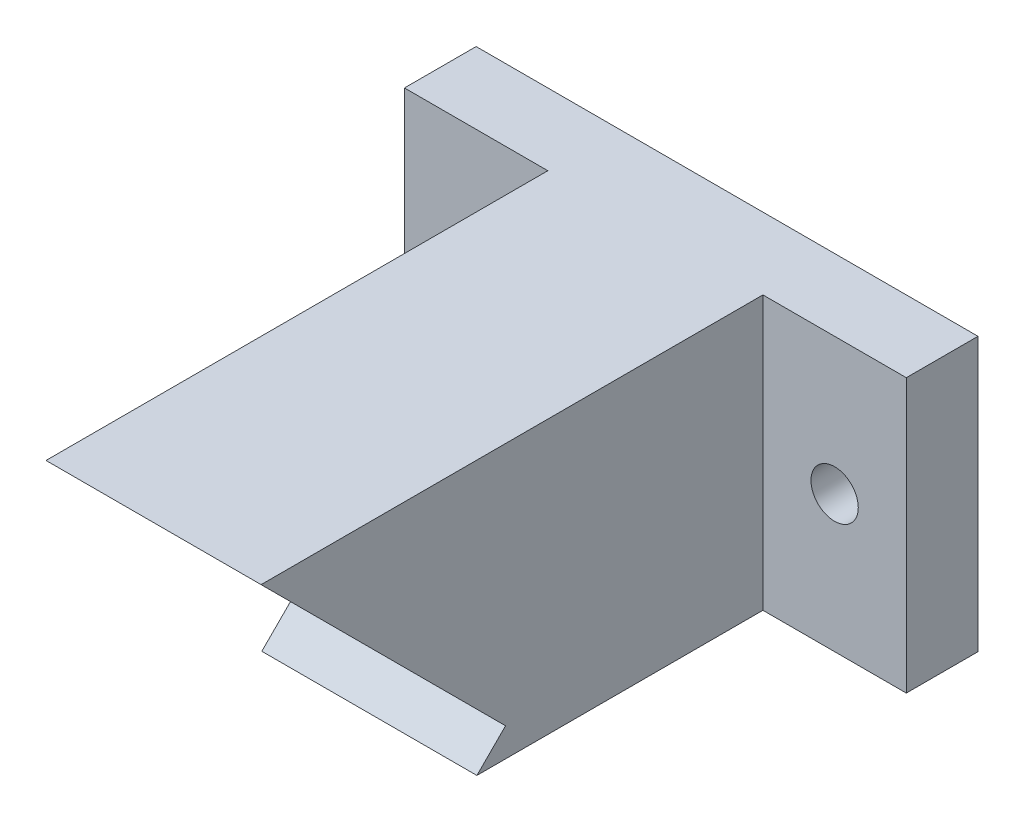
ISO-10303-21;
HEADER;
FILE_DESCRIPTION(('STEP AP214'),'2;1');
FILE_NAME('part.step','',(''),(''),'','','');
FILE_SCHEMA(('AUTOMOTIVE_DESIGN { 1 0 10303 214 1 1 1 1 }'));
ENDSEC;
DATA;
#1=APPLICATION_CONTEXT('core data for automotive mechanical design processes');
#2=APPLICATION_PROTOCOL_DEFINITION('international standard','automotive_design',2000,#1);
#3=PRODUCT_CONTEXT('',#1,'mechanical');
#4=PRODUCT('Part','Part','',(#3));
#5=PRODUCT_RELATED_PRODUCT_CATEGORY('part','',(#4));
#6=PRODUCT_DEFINITION_FORMATION('','',#4);
#7=PRODUCT_DEFINITION_CONTEXT('part definition',#1,'design');
#8=PRODUCT_DEFINITION('design','',#6,#7);
#9=PRODUCT_DEFINITION_SHAPE('','',#8);
#10=(LENGTH_UNIT() NAMED_UNIT(*) SI_UNIT(.MILLI.,.METRE.));
#11=(NAMED_UNIT(*) PLANE_ANGLE_UNIT() SI_UNIT($,.RADIAN.));
#12=(NAMED_UNIT(*) SI_UNIT($,.STERADIAN.) SOLID_ANGLE_UNIT());
#13=UNCERTAINTY_MEASURE_WITH_UNIT(LENGTH_MEASURE(1.E-05),#10,'distance_accuracy_value','');
#14=(GEOMETRIC_REPRESENTATION_CONTEXT(3) GLOBAL_UNCERTAINTY_ASSIGNED_CONTEXT((#13)) GLOBAL_UNIT_ASSIGNED_CONTEXT((#10,
#11,#12)) REPRESENTATION_CONTEXT('',''));
#15=CARTESIAN_POINT('',(0.,0.,0.));
#16=DIRECTION('',(0.,0.,1.));
#17=DIRECTION('',(1.,0.,0.));
#18=AXIS2_PLACEMENT_3D('',#15,#16,#17);
#19=CARTESIAN_POINT('',(7.5,-5.,40.));
#20=DIRECTION('',(-1.,0.,0.));
#21=DIRECTION('',(0.,0.,1.));
#22=AXIS2_PLACEMENT_3D('',#19,#20,#21);
#23=PLANE('',#22);
#24=DIRECTION('',(0.,0.707106781186547,0.707106781186548));
#25=VECTOR('',#24,1.);
#26=CARTESIAN_POINT('',(7.5,-5.,30.));
#27=LINE('',#26,#25);
#28=CARTESIAN_POINT('',(7.5,-12.0507433742728,22.9492566257272));
#29=VERTEX_POINT('',#28);
#30=CARTESIAN_POINT('',(7.5,5.,40.));
#31=VERTEX_POINT('',#30);
#32=EDGE_CURVE('E155',#29,#31,#27,.T.);
#33=ORIENTED_EDGE('',*,*,#32,.F.);
#34=DIRECTION('',(0.,0.707106781186559,-0.707106781186536));
#35=VECTOR('',#34,1.);
#36=CARTESIAN_POINT('',(7.5,-12.0507433742728,22.9492566257272));
#37=LINE('',#36,#35);
#38=CARTESIAN_POINT('',(7.5,-14.0507433742728,24.9492566257272));
#39=VERTEX_POINT('',#38);
#40=EDGE_CURVE('E149',#39,#29,#37,.T.);
#41=ORIENTED_EDGE('',*,*,#40,.F.);
#42=DIRECTION('',(0.,0.,1.));
#43=VECTOR('',#42,1.);
#44=CARTESIAN_POINT('',(7.5,-14.0507433742728,24.5));
#45=LINE('',#44,#43);
#46=CARTESIAN_POINT('',(7.5,-14.0507433742728,5.));
#47=VERTEX_POINT('',#46);
#48=EDGE_CURVE('E134',#47,#39,#45,.T.);
#49=ORIENTED_EDGE('',*,*,#48,.F.);
#50=DIRECTION('',(0.,-1.,0.));
#51=VECTOR('',#50,1.);
#52=CARTESIAN_POINT('',(7.5,-5.,5.));
#53=LINE('',#52,#51);
#54=CARTESIAN_POINT('',(7.5,5.,5.));
#55=VERTEX_POINT('',#54);
#56=EDGE_CURVE('E51',#55,#47,#53,.T.);
#57=ORIENTED_EDGE('',*,*,#56,.F.);
#58=DIRECTION('',(0.,0.,-1.));
#59=VECTOR('',#58,1.);
#60=CARTESIAN_POINT('',(7.5,5.,40.));
#61=LINE('',#60,#59);
#62=EDGE_CURVE('E244',#31,#55,#61,.T.);
#63=ORIENTED_EDGE('',*,*,#62,.F.);
#64=EDGE_LOOP('',(#33,#41,#49,#57,#63));
#65=FACE_BOUND('',#64,.T.);
#66=ADVANCED_FACE('F37',(#65),#23,.F.);
#67=CARTESIAN_POINT('',(-7.5,-5.,40.));
#68=DIRECTION('',(1.,0.,0.));
#69=DIRECTION('',(0.,0.,-1.));
#70=AXIS2_PLACEMENT_3D('',#67,#68,#69);
#71=PLANE('',#70);
#72=DIRECTION('',(0.,1.,0.));
#73=VECTOR('',#72,1.);
#74=CARTESIAN_POINT('',(-7.5,-5.,5.));
#75=LINE('',#74,#73);
#76=CARTESIAN_POINT('',(-7.5,-14.0507433742728,5.));
#77=VERTEX_POINT('',#76);
#78=CARTESIAN_POINT('',(-7.5,5.,5.));
#79=VERTEX_POINT('',#78);
#80=EDGE_CURVE('E211',#77,#79,#75,.T.);
#81=ORIENTED_EDGE('',*,*,#80,.F.);
#82=DIRECTION('',(0.,0.,-1.));
#83=VECTOR('',#82,1.);
#84=CARTESIAN_POINT('',(-7.5,-14.0507433742728,0.));
#85=LINE('',#84,#83);
#86=CARTESIAN_POINT('',(-7.5,-14.0507433742728,24.9492566257272));
#87=VERTEX_POINT('',#86);
#88=EDGE_CURVE('E231',#87,#77,#85,.T.);
#89=ORIENTED_EDGE('',*,*,#88,.F.);
#90=DIRECTION('',(0.,0.707106781186559,-0.707106781186536));
#91=VECTOR('',#90,1.);
#92=CARTESIAN_POINT('',(-7.5,-12.0507433742728,22.9492566257272));
#93=LINE('',#92,#91);
#94=CARTESIAN_POINT('',(-7.5,-12.0507433742728,22.9492566257272));
#95=VERTEX_POINT('',#94);
#96=EDGE_CURVE('E152',#87,#95,#93,.T.);
#97=ORIENTED_EDGE('',*,*,#96,.T.);
#98=DIRECTION('',(0.,0.707106781186547,0.707106781186548));
#99=VECTOR('',#98,1.);
#100=CARTESIAN_POINT('',(-7.5,0.,35.));
#101=LINE('',#100,#99);
#102=CARTESIAN_POINT('',(-7.5,5.,40.));
#103=VERTEX_POINT('',#102);
#104=EDGE_CURVE('E237',#95,#103,#101,.T.);
#105=ORIENTED_EDGE('',*,*,#104,.T.);
#106=DIRECTION('',(0.,0.,-1.));
#107=VECTOR('',#106,1.);
#108=CARTESIAN_POINT('',(-7.5,5.,40.));
#109=LINE('',#108,#107);
#110=EDGE_CURVE('E59',#103,#79,#109,.T.);
#111=ORIENTED_EDGE('',*,*,#110,.T.);
#112=EDGE_LOOP('',(#81,#89,#97,#105,#111));
#113=FACE_BOUND('',#112,.T.);
#114=ADVANCED_FACE('F279',(#113),#71,.F.);
#115=CARTESIAN_POINT('',(0.,-12.0507433742728,0.));
#116=DIRECTION('',(0.,1.,0.));
#117=DIRECTION('',(0.,0.,1.));
#118=AXIS2_PLACEMENT_3D('',#115,#116,#117);
#119=PLANE('',#118);
#120=DIRECTION('',(-1.,0.,0.));
#121=VECTOR('',#120,1.);
#122=CARTESIAN_POINT('',(17.5,-12.0507433742728,22.9492566257272));
#123=LINE('',#122,#121);
#124=CARTESIAN_POINT('',(5.5,-12.0507433742728,22.9492566257272));
#125=VERTEX_POINT('',#124);
#126=CARTESIAN_POINT('',(-5.5,-12.0507433742728,22.9492566257272));
#127=VERTEX_POINT('',#126);
#128=EDGE_CURVE('E153',#125,#127,#123,.T.);
#129=ORIENTED_EDGE('',*,*,#128,.F.);
#130=DIRECTION('',(0.,0.,-1.));
#131=VECTOR('',#130,1.);
#132=CARTESIAN_POINT('',(5.5,-12.0507433742728,40.));
#133=LINE('',#132,#131);
#134=CARTESIAN_POINT('',(5.5,-12.0507433742728,5.));
#135=VERTEX_POINT('',#134);
#136=EDGE_CURVE('E222',#125,#135,#133,.T.);
#137=ORIENTED_EDGE('',*,*,#136,.T.);
#138=DIRECTION('',(-1.,0.,0.));
#139=VECTOR('',#138,1.);
#140=CARTESIAN_POINT('',(0.,-12.0507433742728,5.));
#141=LINE('',#140,#139);
#142=CARTESIAN_POINT('',(-5.5,-12.0507433742728,5.));
#143=VERTEX_POINT('',#142);
#144=EDGE_CURVE('E206',#135,#143,#141,.T.);
#145=ORIENTED_EDGE('',*,*,#144,.T.);
#146=DIRECTION('',(0.,0.,-1.));
#147=VECTOR('',#146,1.);
#148=CARTESIAN_POINT('',(-5.5,-12.0507433742728,40.));
#149=LINE('',#148,#147);
#150=EDGE_CURVE('E219',#127,#143,#149,.T.);
#151=ORIENTED_EDGE('',*,*,#150,.F.);
#152=EDGE_LOOP('',(#129,#137,#145,#151));
#153=FACE_BOUND('',#152,.T.);
#154=ADVANCED_FACE('F264',(#153),#119,.T.);
#155=CARTESIAN_POINT('',(0.,3.,40.));
#156=DIRECTION('',(0.,1.,0.));
#157=DIRECTION('',(-1.,0.,0.));
#158=AXIS2_PLACEMENT_3D('',#155,#156,#157);
#159=PLANE('',#158);
#160=DIRECTION('',(-1.,0.,0.));
#161=VECTOR('',#160,1.);
#162=CARTESIAN_POINT('',(0.,3.,5.));
#163=LINE('',#162,#161);
#164=CARTESIAN_POINT('',(5.5,3.,5.));
#165=VERTEX_POINT('',#164);
#166=CARTESIAN_POINT('',(-5.5,3.,5.));
#167=VERTEX_POINT('',#166);
#168=EDGE_CURVE('E195',#165,#167,#163,.T.);
#169=ORIENTED_EDGE('',*,*,#168,.F.);
#170=DIRECTION('',(0.,0.,-1.));
#171=VECTOR('',#170,1.);
#172=CARTESIAN_POINT('',(5.5,3.,40.));
#173=LINE('',#172,#171);
#174=CARTESIAN_POINT('',(5.5,3.,38.));
#175=VERTEX_POINT('',#174);
#176=EDGE_CURVE('E214',#175,#165,#173,.T.);
#177=ORIENTED_EDGE('',*,*,#176,.F.);
#178=DIRECTION('',(1.,0.,0.));
#179=VECTOR('',#178,1.);
#180=CARTESIAN_POINT('',(-32.5,3.,38.));
#181=LINE('',#180,#179);
#182=CARTESIAN_POINT('',(-5.5,3.,38.));
#183=VERTEX_POINT('',#182);
#184=EDGE_CURVE('E44',#183,#175,#181,.T.);
#185=ORIENTED_EDGE('',*,*,#184,.F.);
#186=DIRECTION('',(0.,0.,-1.));
#187=VECTOR('',#186,1.);
#188=CARTESIAN_POINT('',(-5.5,3.,40.));
#189=LINE('',#188,#187);
#190=EDGE_CURVE('E215',#183,#167,#189,.T.);
#191=ORIENTED_EDGE('',*,*,#190,.T.);
#192=EDGE_LOOP('',(#169,#177,#185,#191));
#193=FACE_BOUND('',#192,.T.);
#194=ADVANCED_FACE('F253',(#193),#159,.F.);
#195=CARTESIAN_POINT('',(-5.5,0.,40.));
#196=DIRECTION('',(-1.,0.,0.));
#197=DIRECTION('',(0.,-1.,0.));
#198=AXIS2_PLACEMENT_3D('',#195,#196,#197);
#199=PLANE('',#198);
#200=DIRECTION('',(0.,-1.,0.));
#201=VECTOR('',#200,1.);
#202=CARTESIAN_POINT('',(-5.5,0.,5.));
#203=LINE('',#202,#201);
#204=EDGE_CURVE('E208',#167,#143,#203,.T.);
#205=ORIENTED_EDGE('',*,*,#204,.F.);
#206=ORIENTED_EDGE('',*,*,#190,.F.);
#207=DIRECTION('',(0.,0.707106781186547,0.707106781186548));
#208=VECTOR('',#207,1.);
#209=CARTESIAN_POINT('',(-5.5,-5.,30.));
#210=LINE('',#209,#208);
#211=EDGE_CURVE('E228',#127,#183,#210,.T.);
#212=ORIENTED_EDGE('',*,*,#211,.F.);
#213=ORIENTED_EDGE('',*,*,#150,.T.);
#214=EDGE_LOOP('',(#205,#206,#212,#213));
#215=FACE_BOUND('',#214,.T.);
#216=ADVANCED_FACE('F255',(#215),#199,.F.);
#217=CARTESIAN_POINT('',(5.5,0.,40.));
#218=DIRECTION('',(1.,0.,0.));
#219=DIRECTION('',(0.,0.,-1.));
#220=AXIS2_PLACEMENT_3D('',#217,#218,#219);
#221=PLANE('',#220);
#222=DIRECTION('',(0.,1.,0.));
#223=VECTOR('',#222,1.);
#224=CARTESIAN_POINT('',(5.5,0.,5.));
#225=LINE('',#224,#223);
#226=EDGE_CURVE('E11',#135,#165,#225,.T.);
#227=ORIENTED_EDGE('',*,*,#226,.F.);
#228=ORIENTED_EDGE('',*,*,#136,.F.);
#229=DIRECTION('',(0.,-0.707106781186547,-0.707106781186548));
#230=VECTOR('',#229,1.);
#231=CARTESIAN_POINT('',(5.5,-5.,30.));
#232=LINE('',#231,#230);
#233=EDGE_CURVE('E218',#175,#125,#232,.T.);
#234=ORIENTED_EDGE('',*,*,#233,.F.);
#235=ORIENTED_EDGE('',*,*,#176,.T.);
#236=EDGE_LOOP('',(#227,#228,#234,#235));
#237=FACE_BOUND('',#236,.T.);
#238=ADVANCED_FACE('F262',(#237),#221,.F.);
#239=CARTESIAN_POINT('',(-7.5,5.,40.));
#240=DIRECTION('',(0.,-1.,0.));
#241=DIRECTION('',(0.,0.,-1.));
#242=AXIS2_PLACEMENT_3D('',#239,#240,#241);
#243=PLANE('',#242);
#244=DIRECTION('',(-1.,0.,0.));
#245=VECTOR('',#244,1.);
#246=CARTESIAN_POINT('',(-7.5,5.,0.));
#247=LINE('',#246,#245);
#248=CARTESIAN_POINT('',(17.5,5.,0.));
#249=VERTEX_POINT('',#248);
#250=CARTESIAN_POINT('',(-17.5,5.,0.));
#251=VERTEX_POINT('',#250);
#252=EDGE_CURVE('E239',#249,#251,#247,.T.);
#253=ORIENTED_EDGE('',*,*,#252,.T.);
#254=DIRECTION('',(0.,0.,-1.));
#255=VECTOR('',#254,1.);
#256=CARTESIAN_POINT('',(-17.5,5.,5.));
#257=LINE('',#256,#255);
#258=CARTESIAN_POINT('',(-17.5,5.,5.));
#259=VERTEX_POINT('',#258);
#260=EDGE_CURVE('E192',#259,#251,#257,.T.);
#261=ORIENTED_EDGE('',*,*,#260,.F.);
#262=DIRECTION('',(-1.,0.,0.));
#263=VECTOR('',#262,1.);
#264=CARTESIAN_POINT('',(0.,5.,5.));
#265=LINE('',#264,#263);
#266=EDGE_CURVE('E179',#79,#259,#265,.T.);
#267=ORIENTED_EDGE('',*,*,#266,.F.);
#268=ORIENTED_EDGE('',*,*,#110,.F.);
#269=DIRECTION('',(-1.,0.,0.));
#270=VECTOR('',#269,1.);
#271=CARTESIAN_POINT('',(-7.5,5.,40.));
#272=LINE('',#271,#270);
#273=EDGE_CURVE('E240',#31,#103,#272,.T.);
#274=ORIENTED_EDGE('',*,*,#273,.F.);
#275=ORIENTED_EDGE('',*,*,#62,.T.);
#276=CARTESIAN_POINT('',(17.5,5.,5.));
#277=VERTEX_POINT('',#276);
#278=EDGE_CURVE('E175',#277,#55,#265,.T.);
#279=ORIENTED_EDGE('',*,*,#278,.F.);
#280=DIRECTION('',(0.,0.,-1.));
#281=VECTOR('',#280,1.);
#282=CARTESIAN_POINT('',(17.5,5.,5.));
#283=LINE('',#282,#281);
#284=EDGE_CURVE('E186',#277,#249,#283,.T.);
#285=ORIENTED_EDGE('',*,*,#284,.T.);
#286=EDGE_LOOP('',(#253,#261,#267,#268,#274,#275,#279,#285));
#287=FACE_BOUND('',#286,.T.);
#288=ADVANCED_FACE('F267',(#287),#243,.F.);
#289=CARTESIAN_POINT('',(0.,0.,0.));
#290=DIRECTION('',(0.,0.,-1.));
#291=DIRECTION('',(-1.,0.,0.));
#292=AXIS2_PLACEMENT_3D('',#289,#290,#291);
#293=PLANE('',#292);
#294=CARTESIAN_POINT('',(12.5,-4.52537168713642,0.));
#295=DIRECTION('',(0.,0.,1.));
#296=DIRECTION('',(1.,0.,0.));
#297=AXIS2_PLACEMENT_3D('',#294,#295,#296);
#298=CIRCLE('',#297,1.65);
#299=CARTESIAN_POINT('',(14.15,-4.52537168713642,0.));
#300=VERTEX_POINT('',#299);
#301=EDGE_CURVE('E165',#300,#300,#298,.T.);
#302=ORIENTED_EDGE('',*,*,#301,.T.);
#303=EDGE_LOOP('',(#302));
#304=FACE_BOUND('',#303,.T.);
#305=CARTESIAN_POINT('',(-12.5,-4.52537168713642,0.));
#306=DIRECTION('',(0.,0.,1.));
#307=DIRECTION('',(1.,0.,0.));
#308=AXIS2_PLACEMENT_3D('',#305,#306,#307);
#309=CIRCLE('',#308,1.65);
#310=CARTESIAN_POINT('',(-10.85,-4.52537168713642,0.));
#311=VERTEX_POINT('',#310);
#312=EDGE_CURVE('E171',#311,#311,#309,.T.);
#313=ORIENTED_EDGE('',*,*,#312,.T.);
#314=EDGE_LOOP('',(#313));
#315=FACE_BOUND('',#314,.T.);
#316=ORIENTED_EDGE('',*,*,#252,.F.);
#317=DIRECTION('',(0.,1.,0.));
#318=VECTOR('',#317,1.);
#319=CARTESIAN_POINT('',(17.5,0.,0.));
#320=LINE('',#319,#318);
#321=CARTESIAN_POINT('',(17.5,-14.0507433742729,0.));
#322=VERTEX_POINT('',#321);
#323=EDGE_CURVE('E174',#322,#249,#320,.T.);
#324=ORIENTED_EDGE('',*,*,#323,.F.);
#325=DIRECTION('',(1.,0.,0.));
#326=VECTOR('',#325,1.);
#327=CARTESIAN_POINT('',(7.5,-14.0507433742728,0.));
#328=LINE('',#327,#326);
#329=CARTESIAN_POINT('',(-17.5,-14.0507433742728,0.));
#330=VERTEX_POINT('',#329);
#331=EDGE_CURVE('E143',#330,#322,#328,.T.);
#332=ORIENTED_EDGE('',*,*,#331,.F.);
#333=DIRECTION('',(0.,-1.,0.));
#334=VECTOR('',#333,1.);
#335=CARTESIAN_POINT('',(-17.5,0.,0.));
#336=LINE('',#335,#334);
#337=EDGE_CURVE('E189',#251,#330,#336,.T.);
#338=ORIENTED_EDGE('',*,*,#337,.F.);
#339=EDGE_LOOP('',(#316,#324,#332,#338));
#340=FACE_BOUND('',#339,.T.);
#341=ADVANCED_FACE('F289',(#304,#315,#340),#293,.T.);
#342=CARTESIAN_POINT('',(-32.5,-5.,30.));
#343=DIRECTION('',(0.,0.707106781186548,-0.707106781186547));
#344=DIRECTION('',(0.,0.707106781186547,0.707106781186548));
#345=AXIS2_PLACEMENT_3D('',#342,#343,#344);
#346=PLANE('',#345);
#347=DIRECTION('',(-1.,0.,0.));
#348=VECTOR('',#347,1.);
#349=CARTESIAN_POINT('',(7.5,-12.0507433742728,22.9492566257273));
#350=LINE('',#349,#348);
#351=EDGE_CURVE('E142',#127,#95,#350,.T.);
#352=ORIENTED_EDGE('',*,*,#351,.F.);
#353=ORIENTED_EDGE('',*,*,#211,.T.);
#354=ORIENTED_EDGE('',*,*,#184,.T.);
#355=ORIENTED_EDGE('',*,*,#233,.T.);
#356=EDGE_CURVE('E234',#29,#125,#350,.T.);
#357=ORIENTED_EDGE('',*,*,#356,.F.);
#358=ORIENTED_EDGE('',*,*,#32,.T.);
#359=ORIENTED_EDGE('',*,*,#273,.T.);
#360=ORIENTED_EDGE('',*,*,#104,.F.);
#361=EDGE_LOOP('',(#352,#353,#354,#355,#357,#358,#359,#360));
#362=FACE_BOUND('',#361,.T.);
#363=ADVANCED_FACE('F248',(#362),#346,.F.);
#364=CARTESIAN_POINT('',(0.,-14.0507433742728,0.));
#365=DIRECTION('',(0.,1.,0.));
#366=DIRECTION('',(0.,0.,1.));
#367=AXIS2_PLACEMENT_3D('',#364,#365,#366);
#368=PLANE('',#367);
#369=ORIENTED_EDGE('',*,*,#48,.T.);
#370=DIRECTION('',(-1.,0.,0.));
#371=VECTOR('',#370,1.);
#372=CARTESIAN_POINT('',(7.5,-14.0507433742728,24.9492566257272));
#373=LINE('',#372,#371);
#374=EDGE_CURVE('E137',#39,#87,#373,.T.);
#375=ORIENTED_EDGE('',*,*,#374,.T.);
#376=ORIENTED_EDGE('',*,*,#88,.T.);
#377=DIRECTION('',(1.,0.,0.));
#378=VECTOR('',#377,1.);
#379=CARTESIAN_POINT('',(0.,-14.0507433742728,5.));
#380=LINE('',#379,#378);
#381=CARTESIAN_POINT('',(-17.5,-14.0507433742728,5.));
#382=VERTEX_POINT('',#381);
#383=EDGE_CURVE('E181',#382,#77,#380,.T.);
#384=ORIENTED_EDGE('',*,*,#383,.F.);
#385=DIRECTION('',(0.,0.,-1.));
#386=VECTOR('',#385,1.);
#387=CARTESIAN_POINT('',(-17.5,-14.0507433742728,5.));
#388=LINE('',#387,#386);
#389=EDGE_CURVE('E196',#382,#330,#388,.T.);
#390=ORIENTED_EDGE('',*,*,#389,.T.);
#391=ORIENTED_EDGE('',*,*,#331,.T.);
#392=DIRECTION('',(0.,0.,-1.));
#393=VECTOR('',#392,1.);
#394=CARTESIAN_POINT('',(17.5,-14.0507433742729,5.));
#395=LINE('',#394,#393);
#396=CARTESIAN_POINT('',(17.5,-14.0507433742729,5.));
#397=VERTEX_POINT('',#396);
#398=EDGE_CURVE('E199',#397,#322,#395,.T.);
#399=ORIENTED_EDGE('',*,*,#398,.F.);
#400=EDGE_CURVE('E140',#47,#397,#380,.T.);
#401=ORIENTED_EDGE('',*,*,#400,.F.);
#402=EDGE_LOOP('',(#369,#375,#376,#384,#390,#391,#399,#401));
#403=FACE_BOUND('',#402,.T.);
#404=ADVANCED_FACE('F136',(#403),#368,.F.);
#405=CARTESIAN_POINT('',(0.,0.,5.));
#406=DIRECTION('',(0.,0.,-1.));
#407=DIRECTION('',(-1.,0.,0.));
#408=AXIS2_PLACEMENT_3D('',#405,#406,#407);
#409=PLANE('',#408);
#410=ORIENTED_EDGE('',*,*,#168,.T.);
#411=ORIENTED_EDGE('',*,*,#204,.T.);
#412=ORIENTED_EDGE('',*,*,#144,.F.);
#413=ORIENTED_EDGE('',*,*,#226,.T.);
#414=EDGE_LOOP('',(#410,#411,#412,#413));
#415=FACE_BOUND('',#414,.T.);
#416=ADVANCED_FACE('F259',(#415),#409,.F.);
#417=CARTESIAN_POINT('',(-17.5,0.,5.));
#418=DIRECTION('',(1.,0.,0.));
#419=DIRECTION('',(0.,0.,-1.));
#420=AXIS2_PLACEMENT_3D('',#417,#418,#419);
#421=PLANE('',#420);
#422=ORIENTED_EDGE('',*,*,#337,.T.);
#423=ORIENTED_EDGE('',*,*,#389,.F.);
#424=DIRECTION('',(0.,-1.,0.));
#425=VECTOR('',#424,1.);
#426=CARTESIAN_POINT('',(-17.5,0.,5.));
#427=LINE('',#426,#425);
#428=EDGE_CURVE('E184',#259,#382,#427,.T.);
#429=ORIENTED_EDGE('',*,*,#428,.F.);
#430=ORIENTED_EDGE('',*,*,#260,.T.);
#431=EDGE_LOOP('',(#422,#423,#429,#430));
#432=FACE_BOUND('',#431,.T.);
#433=ADVANCED_FACE('F276',(#432),#421,.F.);
#434=CARTESIAN_POINT('',(-12.5,-4.52537168713642,5.));
#435=DIRECTION('',(0.,0.,1.));
#436=DIRECTION('',(1.,0.,0.));
#437=AXIS2_PLACEMENT_3D('',#434,#435,#436);
#438=CIRCLE('',#437,1.64999999999999);
#439=CARTESIAN_POINT('',(-10.85,-4.52537168713642,5.));
#440=VERTEX_POINT('',#439);
#441=EDGE_CURVE('E168',#440,#440,#438,.T.);
#442=ORIENTED_EDGE('',*,*,#441,.F.);
#443=EDGE_LOOP('',(#442));
#444=FACE_BOUND('',#443,.T.);
#445=ORIENTED_EDGE('',*,*,#383,.T.);
#446=ORIENTED_EDGE('',*,*,#80,.T.);
#447=ORIENTED_EDGE('',*,*,#266,.T.);
#448=ORIENTED_EDGE('',*,*,#428,.T.);
#449=EDGE_LOOP('',(#445,#446,#447,#448));
#450=FACE_BOUND('',#449,.T.);
#451=ADVANCED_FACE('F273',(#444,#450),#409,.F.);
#452=CARTESIAN_POINT('',(12.5,-4.52537168713642,5.));
#453=DIRECTION('',(0.,0.,1.));
#454=DIRECTION('',(1.,0.,0.));
#455=AXIS2_PLACEMENT_3D('',#452,#453,#454);
#456=CIRCLE('',#455,1.64999999999999);
#457=CARTESIAN_POINT('',(14.15,-4.52537168713642,5.));
#458=VERTEX_POINT('',#457);
#459=EDGE_CURVE('E162',#458,#458,#456,.T.);
#460=ORIENTED_EDGE('',*,*,#459,.F.);
#461=EDGE_LOOP('',(#460));
#462=FACE_BOUND('',#461,.T.);
#463=ORIENTED_EDGE('',*,*,#278,.T.);
#464=ORIENTED_EDGE('',*,*,#56,.T.);
#465=ORIENTED_EDGE('',*,*,#400,.T.);
#466=DIRECTION('',(0.,1.,0.));
#467=VECTOR('',#466,1.);
#468=CARTESIAN_POINT('',(17.5,0.,5.));
#469=LINE('',#468,#467);
#470=EDGE_CURVE('E178',#397,#277,#469,.T.);
#471=ORIENTED_EDGE('',*,*,#470,.T.);
#472=EDGE_LOOP('',(#463,#464,#465,#471));
#473=FACE_BOUND('',#472,.T.);
#474=ADVANCED_FACE('F338',(#462,#473),#409,.F.);
#475=CARTESIAN_POINT('',(17.5,0.,5.));
#476=DIRECTION('',(-1.,0.,0.));
#477=DIRECTION('',(0.,0.,1.));
#478=AXIS2_PLACEMENT_3D('',#475,#476,#477);
#479=PLANE('',#478);
#480=ORIENTED_EDGE('',*,*,#323,.T.);
#481=ORIENTED_EDGE('',*,*,#284,.F.);
#482=ORIENTED_EDGE('',*,*,#470,.F.);
#483=ORIENTED_EDGE('',*,*,#398,.T.);
#484=EDGE_LOOP('',(#480,#481,#482,#483));
#485=FACE_BOUND('',#484,.T.);
#486=ADVANCED_FACE('F336',(#485),#479,.F.);
#487=CARTESIAN_POINT('',(-12.5,-4.52537168713642,5.));
#488=DIRECTION('',(0.,0.,1.));
#489=DIRECTION('',(1.,0.,0.));
#490=AXIS2_PLACEMENT_3D('',#487,#488,#489);
#491=CYLINDRICAL_SURFACE('',#490,1.64999999999999);
#492=ORIENTED_EDGE('',*,*,#312,.F.);
#493=EDGE_LOOP('',(#492));
#494=FACE_BOUND('',#493,.T.);
#495=ORIENTED_EDGE('',*,*,#441,.T.);
#496=EDGE_LOOP('',(#495));
#497=FACE_BOUND('',#496,.T.);
#498=ADVANCED_FACE('F330',(#494,#497),#491,.F.);
#499=CARTESIAN_POINT('',(12.5,-4.52537168713642,5.));
#500=DIRECTION('',(0.,0.,1.));
#501=DIRECTION('',(1.,0.,0.));
#502=AXIS2_PLACEMENT_3D('',#499,#500,#501);
#503=CYLINDRICAL_SURFACE('',#502,1.64999999999999);
#504=ORIENTED_EDGE('',*,*,#301,.F.);
#505=EDGE_LOOP('',(#504));
#506=FACE_BOUND('',#505,.T.);
#507=ORIENTED_EDGE('',*,*,#459,.T.);
#508=EDGE_LOOP('',(#507));
#509=FACE_BOUND('',#508,.T.);
#510=ADVANCED_FACE('F324',(#506,#509),#503,.F.);
#511=CARTESIAN_POINT('',(7.5,-12.0507433742728,22.9492566257272));
#512=DIRECTION('',(0.,0.707106781186536,0.707106781186559));
#513=DIRECTION('',(0.,-0.707106781186559,0.707106781186536));
#514=AXIS2_PLACEMENT_3D('',#511,#512,#513);
#515=PLANE('',#514);
#516=ORIENTED_EDGE('',*,*,#96,.F.);
#517=ORIENTED_EDGE('',*,*,#374,.F.);
#518=ORIENTED_EDGE('',*,*,#40,.T.);
#519=ORIENTED_EDGE('',*,*,#356,.T.);
#520=ORIENTED_EDGE('',*,*,#128,.T.);
#521=ORIENTED_EDGE('',*,*,#351,.T.);
#522=EDGE_LOOP('',(#516,#517,#518,#519,#520,#521));
#523=FACE_BOUND('',#522,.T.);
#524=ADVANCED_FACE('F147',(#523),#515,.T.);
#525=CLOSED_SHELL('',(#66,#114,#154,#194,#216,#238,#288,#341,#363,#404,#416,#433,#451,#474,#486,
#498,#510,#524));
#526=MANIFOLD_SOLID_BREP('B2',#525);
#527=ADVANCED_BREP_SHAPE_REPRESENTATION('',(#18,#526),#14);
#528=SHAPE_DEFINITION_REPRESENTATION(#9,#527);
ENDSEC;
END-ISO-10303-21;
